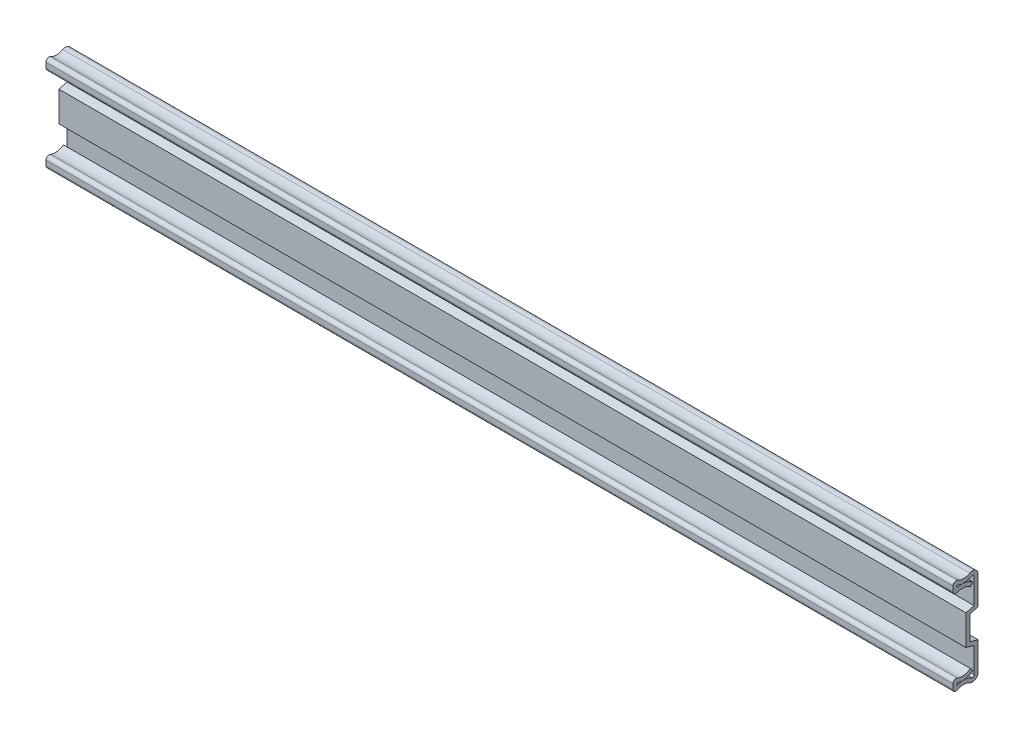
ISO-10303-21;
HEADER;
FILE_DESCRIPTION(('STEP AP214'),'2;1');
FILE_NAME('part.step','',(''),(''),'','','');
FILE_SCHEMA(('AUTOMOTIVE_DESIGN { 1 0 10303 214 1 1 1 1 }'));
ENDSEC;
DATA;
#1=APPLICATION_CONTEXT('core data for automotive mechanical design processes');
#2=APPLICATION_PROTOCOL_DEFINITION('international standard','automotive_design',2000,#1);
#3=PRODUCT_CONTEXT('',#1,'mechanical');
#4=PRODUCT('Part','Part','',(#3));
#5=PRODUCT_RELATED_PRODUCT_CATEGORY('part','',(#4));
#6=PRODUCT_DEFINITION_FORMATION('','',#4);
#7=PRODUCT_DEFINITION_CONTEXT('part definition',#1,'design');
#8=PRODUCT_DEFINITION('design','',#6,#7);
#9=PRODUCT_DEFINITION_SHAPE('','',#8);
#10=(LENGTH_UNIT() NAMED_UNIT(*) SI_UNIT(.MILLI.,.METRE.));
#11=(NAMED_UNIT(*) PLANE_ANGLE_UNIT() SI_UNIT($,.RADIAN.));
#12=(NAMED_UNIT(*) SI_UNIT($,.STERADIAN.) SOLID_ANGLE_UNIT());
#13=UNCERTAINTY_MEASURE_WITH_UNIT(LENGTH_MEASURE(1.E-05),#10,'distance_accuracy_value','');
#14=(GEOMETRIC_REPRESENTATION_CONTEXT(3) GLOBAL_UNCERTAINTY_ASSIGNED_CONTEXT((#13)) GLOBAL_UNIT_ASSIGNED_CONTEXT((#10,
#11,#12)) REPRESENTATION_CONTEXT('',''));
#15=CARTESIAN_POINT('',(0.,0.,0.));
#16=DIRECTION('',(0.,0.,1.));
#17=DIRECTION('',(1.,0.,0.));
#18=AXIS2_PLACEMENT_3D('',#15,#16,#17);
#19=CARTESIAN_POINT('',(-368.3,13.7952118464739,-2.60549626763331));
#20=DIRECTION('',(0.,-0.620994035630214,-0.783815289281665));
#21=DIRECTION('',(0.,0.783815289281665,-0.620994035630214));
#22=AXIS2_PLACEMENT_3D('',#19,#20,#21);
#23=PLANE('',#22);
#24=DIRECTION('',(0.,-0.783815289281665,0.620994035630214));
#25=VECTOR('',#24,1.);
#26=CARTESIAN_POINT('',(-14.224,14.3924790969065,-3.07869372278354));
#27=LINE('',#26,#25);
#28=CARTESIAN_POINT('',(-14.224,14.9897463473391,-3.55189117793377));
#29=VERTEX_POINT('',#28);
#30=CARTESIAN_POINT('',(-14.224,13.7952118464739,-2.60549626763331));
#31=VERTEX_POINT('',#30);
#32=EDGE_CURVE('E367',#29,#31,#27,.T.);
#33=ORIENTED_EDGE('',*,*,#32,.T.);
#34=DIRECTION('',(1.,0.,0.));
#35=VECTOR('',#34,1.);
#36=CARTESIAN_POINT('',(-191.262,13.7952118464739,-2.60549626763331));
#37=LINE('',#36,#35);
#38=CARTESIAN_POINT('',(-368.3,13.7952118464737,-2.60549626763321));
#39=VERTEX_POINT('',#38);
#40=EDGE_CURVE('E320',#39,#31,#37,.T.);
#41=ORIENTED_EDGE('',*,*,#40,.F.);
#42=DIRECTION('',(0.,0.783815289281665,-0.620994035630214));
#43=VECTOR('',#42,1.);
#44=CARTESIAN_POINT('',(-368.3,14.3924790969065,-3.07869372278354));
#45=LINE('',#44,#43);
#46=CARTESIAN_POINT('',(-368.3,14.9897463473391,-3.55189117793377));
#47=VERTEX_POINT('',#46);
#48=EDGE_CURVE('E369',#39,#47,#45,.T.);
#49=ORIENTED_EDGE('',*,*,#48,.T.);
#50=DIRECTION('',(-1.,0.,0.));
#51=VECTOR('',#50,1.);
#52=CARTESIAN_POINT('',(-191.262,14.9897463473391,-3.55189117793377));
#53=LINE('',#52,#51);
#54=EDGE_CURVE('E311',#29,#47,#53,.T.);
#55=ORIENTED_EDGE('',*,*,#54,.F.);
#56=EDGE_LOOP('',(#33,#41,#49,#55));
#57=FACE_BOUND('',#56,.T.);
#58=ADVANCED_FACE('F17',(#57),#23,.T.);
#59=CARTESIAN_POINT('',(-368.3,16.0437321100317,2.64570882206624));
#60=DIRECTION('',(0.,0.,-1.));
#61=DIRECTION('',(0.,1.,0.));
#62=AXIS2_PLACEMENT_3D('',#59,#60,#61);
#63=PLANE('',#62);
#64=DIRECTION('',(0.,-1.,0.));
#65=VECTOR('',#64,1.);
#66=CARTESIAN_POINT('',(-14.224,16.5009321100317,2.64570882206624));
#67=LINE('',#66,#65);
#68=CARTESIAN_POINT('',(-14.2239999999998,16.9581321100249,2.64570882206624));
#69=VERTEX_POINT('',#68);
#70=CARTESIAN_POINT('',(-14.224,16.0437321100317,2.64570882206624));
#71=VERTEX_POINT('',#70);
#72=EDGE_CURVE('E235',#69,#71,#67,.T.);
#73=ORIENTED_EDGE('',*,*,#72,.T.);
#74=DIRECTION('',(1.,0.,0.));
#75=VECTOR('',#74,1.);
#76=CARTESIAN_POINT('',(-191.262,16.0437321100317,2.64570882206624));
#77=LINE('',#76,#75);
#78=CARTESIAN_POINT('',(-368.3,16.0437321100317,2.64570882206624));
#79=VERTEX_POINT('',#78);
#80=EDGE_CURVE('E314',#79,#71,#77,.T.);
#81=ORIENTED_EDGE('',*,*,#80,.F.);
#82=DIRECTION('',(0.,1.,0.));
#83=VECTOR('',#82,1.);
#84=CARTESIAN_POINT('',(-368.3,16.5009321100317,2.64570882206624));
#85=LINE('',#84,#83);
#86=CARTESIAN_POINT('',(-368.3,16.9581321100317,2.64570882206624));
#87=VERTEX_POINT('',#86);
#88=EDGE_CURVE('E365',#79,#87,#85,.T.);
#89=ORIENTED_EDGE('',*,*,#88,.T.);
#90=DIRECTION('',(-1.,0.,0.));
#91=VECTOR('',#90,1.);
#92=CARTESIAN_POINT('',(-191.262,16.9581321100317,2.64570882206624));
#93=LINE('',#92,#91);
#94=EDGE_CURVE('E244',#69,#87,#93,.T.);
#95=ORIENTED_EDGE('',*,*,#94,.F.);
#96=EDGE_LOOP('',(#73,#81,#89,#95));
#97=FACE_BOUND('',#96,.T.);
#98=ADVANCED_FACE('F472',(#97),#63,.T.);
#99=CARTESIAN_POINT('',(-14.224,16.6561828524994,-3.4378409365448));
#100=DIRECTION('',(-1.,0.,0.));
#101=DIRECTION('',(0.,0.,1.));
#102=AXIS2_PLACEMENT_3D('',#99,#100,#101);
#103=CYLINDRICAL_SURFACE('',#102,0.622050241389);
#104=CARTESIAN_POINT('',(-14.224,16.6561828524994,-3.4378409365448));
#105=DIRECTION('',(-1.,0.,0.));
#106=DIRECTION('',(0.,0.,1.));
#107=AXIS2_PLACEMENT_3D('',#104,#105,#106);
#108=CIRCLE('',#107,0.622050241389);
#109=CARTESIAN_POINT('',(-14.224,16.6561828524994,-4.05989117793377));
#110=VERTEX_POINT('',#109);
#111=CARTESIAN_POINT('',(-14.2239999999999,17.2018334118244,-3.13915720762672));
#112=VERTEX_POINT('',#111);
#113=EDGE_CURVE('E234',#110,#112,#108,.F.);
#114=ORIENTED_EDGE('',*,*,#113,.T.);
#115=DIRECTION('',(1.,0.,0.));
#116=VECTOR('',#115,1.);
#117=CARTESIAN_POINT('',(-191.262,17.2018334118245,-3.13915720762698));
#118=LINE('',#117,#116);
#119=CARTESIAN_POINT('',(-368.3,17.2018334118245,-3.13915720762696));
#120=VERTEX_POINT('',#119);
#121=EDGE_CURVE('E232',#120,#112,#118,.T.);
#122=ORIENTED_EDGE('',*,*,#121,.F.);
#123=CARTESIAN_POINT('',(-368.3,16.6561828524994,-3.4378409365448));
#124=DIRECTION('',(-1.,0.,0.));
#125=DIRECTION('',(0.,0.,1.));
#126=AXIS2_PLACEMENT_3D('',#123,#124,#125);
#127=CIRCLE('',#126,0.622050241389);
#128=CARTESIAN_POINT('',(-368.3,16.6561828524994,-4.05989117793377));
#129=VERTEX_POINT('',#128);
#130=EDGE_CURVE('E21',#120,#129,#127,.T.);
#131=ORIENTED_EDGE('',*,*,#130,.T.);
#132=DIRECTION('',(-1.,0.,0.));
#133=VECTOR('',#132,1.);
#134=CARTESIAN_POINT('',(-191.262,16.6561828524995,-4.05989117793377));
#135=LINE('',#134,#133);
#136=EDGE_CURVE('E229',#110,#129,#135,.T.);
#137=ORIENTED_EDGE('',*,*,#136,.F.);
#138=EDGE_LOOP('',(#114,#122,#131,#137));
#139=FACE_BOUND('',#138,.T.);
#140=ADVANCED_FACE('F228',(#139),#103,.F.);
#141=CARTESIAN_POINT('',(-14.224,-16.6561828524995,-3.43784093654483));
#142=DIRECTION('',(-1.,0.,0.));
#143=DIRECTION('',(0.,0.,1.));
#144=AXIS2_PLACEMENT_3D('',#141,#142,#143);
#145=CYLINDRICAL_SURFACE('',#144,0.622050241388938);
#146=CARTESIAN_POINT('',(-14.224,-16.6561828524995,-3.43784093654483));
#147=DIRECTION('',(-1.,0.,0.));
#148=DIRECTION('',(0.,0.,1.));
#149=AXIS2_PLACEMENT_3D('',#146,#147,#148);
#150=CIRCLE('',#149,0.622050241388938);
#151=CARTESIAN_POINT('',(-14.2239999999999,-17.2018334118244,-3.13915720762674));
#152=VERTEX_POINT('',#151);
#153=CARTESIAN_POINT('',(-14.2239999999999,-16.6561828524995,-4.05989117793375));
#154=VERTEX_POINT('',#153);
#155=EDGE_CURVE('E363',#152,#154,#150,.F.);
#156=ORIENTED_EDGE('',*,*,#155,.T.);
#157=DIRECTION('',(1.,0.,0.));
#158=VECTOR('',#157,1.);
#159=CARTESIAN_POINT('',(-191.262,-16.6561828524995,-4.05989117793374));
#160=LINE('',#159,#158);
#161=CARTESIAN_POINT('',(-368.3,-16.6561828525003,-4.05989117793374));
#162=VERTEX_POINT('',#161);
#163=EDGE_CURVE('E296',#162,#154,#160,.T.);
#164=ORIENTED_EDGE('',*,*,#163,.F.);
#165=CARTESIAN_POINT('',(-368.3,-16.6561828525012,-3.43784093654787));
#166=DIRECTION('',(-1.,0.,0.));
#167=DIRECTION('',(0.,0.,1.));
#168=AXIS2_PLACEMENT_3D('',#165,#166,#167);
#169=CIRCLE('',#168,0.622050241388938);
#170=CARTESIAN_POINT('',(-368.3,-17.2018334118253,-3.13915720762836));
#171=VERTEX_POINT('',#170);
#172=EDGE_CURVE('E463',#162,#171,#169,.T.);
#173=ORIENTED_EDGE('',*,*,#172,.T.);
#174=DIRECTION('',(-1.,0.,0.));
#175=VECTOR('',#174,1.);
#176=CARTESIAN_POINT('',(-191.262,-17.2018334118245,-3.13915720762695));
#177=LINE('',#176,#175);
#178=EDGE_CURVE('E287',#152,#171,#177,.T.);
#179=ORIENTED_EDGE('',*,*,#178,.F.);
#180=EDGE_LOOP('',(#156,#164,#173,#179));
#181=FACE_BOUND('',#180,.T.);
#182=ADVANCED_FACE('F814',(#181),#145,.F.);
#183=CARTESIAN_POINT('',(-14.224,-16.9581321100317,2.64570882206624));
#184=DIRECTION('',(0.,0.,-1.));
#185=DIRECTION('',(-1.,0.,0.));
#186=AXIS2_PLACEMENT_3D('',#183,#184,#185);
#187=PLANE('',#186);
#188=DIRECTION('',(0.,-1.,0.));
#189=VECTOR('',#188,1.);
#190=CARTESIAN_POINT('',(-14.224,-16.5009321100317,2.64570882206624));
#191=LINE('',#190,#189);
#192=CARTESIAN_POINT('',(-14.224,-16.0437321100317,2.64570882206624));
#193=VERTEX_POINT('',#192);
#194=CARTESIAN_POINT('',(-14.2239999999998,-16.9581321100249,2.64570882206624));
#195=VERTEX_POINT('',#194);
#196=EDGE_CURVE('E359',#193,#195,#191,.T.);
#197=ORIENTED_EDGE('',*,*,#196,.T.);
#198=DIRECTION('',(1.,0.,0.));
#199=VECTOR('',#198,1.);
#200=CARTESIAN_POINT('',(-191.262,-16.9581321100317,2.64570882206624));
#201=LINE('',#200,#199);
#202=CARTESIAN_POINT('',(-368.3,-16.9581321100317,2.64570882206624));
#203=VERTEX_POINT('',#202);
#204=EDGE_CURVE('E290',#203,#195,#201,.T.);
#205=ORIENTED_EDGE('',*,*,#204,.F.);
#206=DIRECTION('',(0.,1.,0.));
#207=VECTOR('',#206,1.);
#208=CARTESIAN_POINT('',(-368.3,-16.5009321100317,2.64570882206624));
#209=LINE('',#208,#207);
#210=CARTESIAN_POINT('',(-368.3,-16.0437321100317,2.64570882206624));
#211=VERTEX_POINT('',#210);
#212=EDGE_CURVE('E361',#203,#211,#209,.T.);
#213=ORIENTED_EDGE('',*,*,#212,.T.);
#214=DIRECTION('',(-1.,0.,0.));
#215=VECTOR('',#214,1.);
#216=CARTESIAN_POINT('',(-191.262,-16.0437321100317,2.64570882206624));
#217=LINE('',#216,#215);
#218=EDGE_CURVE('E283',#193,#211,#217,.T.);
#219=ORIENTED_EDGE('',*,*,#218,.F.);
#220=EDGE_LOOP('',(#197,#205,#213,#219));
#221=FACE_BOUND('',#220,.T.);
#222=ADVANCED_FACE('F805',(#221),#187,.T.);
#223=CARTESIAN_POINT('',(-368.3,-14.9897463473391,-3.55189117793377));
#224=DIRECTION('',(0.,0.620994035630214,-0.783815289281665));
#225=DIRECTION('',(0.,0.783815289281665,0.620994035630214));
#226=AXIS2_PLACEMENT_3D('',#223,#224,#225);
#227=PLANE('',#226);
#228=DIRECTION('',(0.,-0.783815289281665,-0.620994035630214));
#229=VECTOR('',#228,1.);
#230=CARTESIAN_POINT('',(-14.224,-14.3924790969065,-3.07869372278354));
#231=LINE('',#230,#229);
#232=CARTESIAN_POINT('',(-14.224,-13.7952118464739,-2.60549626763331));
#233=VERTEX_POINT('',#232);
#234=CARTESIAN_POINT('',(-14.224,-14.9897463473391,-3.55189117793377));
#235=VERTEX_POINT('',#234);
#236=EDGE_CURVE('E345',#233,#235,#231,.T.);
#237=ORIENTED_EDGE('',*,*,#236,.T.);
#238=DIRECTION('',(1.,0.,0.));
#239=VECTOR('',#238,1.);
#240=CARTESIAN_POINT('',(-191.262,-14.9897463473391,-3.55189117793377));
#241=LINE('',#240,#239);
#242=CARTESIAN_POINT('',(-368.3,-14.9897463473391,-3.55189117793377));
#243=VERTEX_POINT('',#242);
#244=EDGE_CURVE('E284',#243,#235,#241,.T.);
#245=ORIENTED_EDGE('',*,*,#244,.F.);
#246=DIRECTION('',(0.,0.783815289281665,0.620994035630214));
#247=VECTOR('',#246,1.);
#248=CARTESIAN_POINT('',(-368.3,-14.3924790969065,-3.07869372278354));
#249=LINE('',#248,#247);
#250=CARTESIAN_POINT('',(-368.3,-13.7952118464737,-2.60549626763321));
#251=VERTEX_POINT('',#250);
#252=EDGE_CURVE('E357',#243,#251,#249,.T.);
#253=ORIENTED_EDGE('',*,*,#252,.T.);
#254=DIRECTION('',(-1.,0.,0.));
#255=VECTOR('',#254,1.);
#256=CARTESIAN_POINT('',(-191.262,-13.7952118464739,-2.60549626763331));
#257=LINE('',#256,#255);
#258=EDGE_CURVE('E280',#233,#251,#257,.T.);
#259=ORIENTED_EDGE('',*,*,#258,.F.);
#260=EDGE_LOOP('',(#237,#245,#253,#259));
#261=FACE_BOUND('',#260,.T.);
#262=ADVANCED_FACE('F797',(#261),#227,.T.);
#263=CARTESIAN_POINT('',(-368.3,-5.55625,-5.58389117793377));
#264=DIRECTION('',(0.,0.965925826289069,-0.258819045102518));
#265=DIRECTION('',(0.,0.258819045102518,0.965925826289069));
#266=AXIS2_PLACEMENT_3D('',#263,#264,#265);
#267=PLANE('',#266);
#268=DIRECTION('',(0.,0.258819045102518,0.965925826289069));
#269=VECTOR('',#268,1.);
#270=CARTESIAN_POINT('',(-14.224,-5.55625,-5.58389117793376));
#271=LINE('',#270,#269);
#272=CARTESIAN_POINT('',(-14.2239999999999,-5.55625,-5.58389117793377));
#273=VERTEX_POINT('',#272);
#274=CARTESIAN_POINT('',(-14.2239999999999,-4.7055113140312,-2.40889117793376));
#275=VERTEX_POINT('',#274);
#276=EDGE_CURVE('E343',#273,#275,#271,.T.);
#277=ORIENTED_EDGE('',*,*,#276,.F.);
#278=DIRECTION('',(1.,0.,0.));
#279=VECTOR('',#278,1.);
#280=CARTESIAN_POINT('',(-191.262,-5.55625,-5.58389117793377));
#281=LINE('',#280,#279);
#282=CARTESIAN_POINT('',(-368.3,-5.55625,-5.58389117793377));
#283=VERTEX_POINT('',#282);
#284=EDGE_CURVE('E346',#283,#273,#281,.T.);
#285=ORIENTED_EDGE('',*,*,#284,.F.);
#286=DIRECTION('',(0.,-0.258819045102518,-0.965925826289069));
#287=VECTOR('',#286,1.);
#288=CARTESIAN_POINT('',(-368.3,-4.7055113140312,-2.40889117793376));
#289=LINE('',#288,#287);
#290=CARTESIAN_POINT('',(-368.3,-4.7055113140312,-2.40889117793376));
#291=VERTEX_POINT('',#290);
#292=EDGE_CURVE('E353',#291,#283,#289,.T.);
#293=ORIENTED_EDGE('',*,*,#292,.F.);
#294=DIRECTION('',(-1.,0.,0.));
#295=VECTOR('',#294,1.);
#296=CARTESIAN_POINT('',(-191.262,-4.7055113140312,-2.40889117793375));
#297=LINE('',#296,#295);
#298=EDGE_CURVE('E338',#275,#291,#297,.T.);
#299=ORIENTED_EDGE('',*,*,#298,.F.);
#300=EDGE_LOOP('',(#277,#285,#293,#299));
#301=FACE_BOUND('',#300,.T.);
#302=ADVANCED_FACE('F545',(#301),#267,.T.);
#303=CARTESIAN_POINT('',(-368.3,-4.7055113140312,-2.40889117793375));
#304=DIRECTION('',(0.,0.,-1.));
#305=DIRECTION('',(0.,1.,0.));
#306=AXIS2_PLACEMENT_3D('',#303,#304,#305);
#307=PLANE('',#306);
#308=DIRECTION('',(0.,1.,0.));
#309=VECTOR('',#308,1.);
#310=CARTESIAN_POINT('',(-14.224,0.,-2.40889117793376));
#311=LINE('',#310,#309);
#312=CARTESIAN_POINT('',(-14.2239999999999,4.70551131403119,-2.40889117793376));
#313=VERTEX_POINT('',#312);
#314=EDGE_CURVE('E339',#275,#313,#311,.T.);
#315=ORIENTED_EDGE('',*,*,#314,.F.);
#316=ORIENTED_EDGE('',*,*,#298,.T.);
#317=DIRECTION('',(0.,-1.,0.));
#318=VECTOR('',#317,1.);
#319=CARTESIAN_POINT('',(-368.3,0.,-2.40889117793376));
#320=LINE('',#319,#318);
#321=CARTESIAN_POINT('',(-368.3,4.70551131403119,-2.40889117793376));
#322=VERTEX_POINT('',#321);
#323=EDGE_CURVE('E350',#322,#291,#320,.T.);
#324=ORIENTED_EDGE('',*,*,#323,.F.);
#325=DIRECTION('',(-1.,0.,0.));
#326=VECTOR('',#325,1.);
#327=CARTESIAN_POINT('',(-191.262,4.7055113140312,-2.40889117793375));
#328=LINE('',#327,#326);
#329=EDGE_CURVE('E336',#313,#322,#328,.T.);
#330=ORIENTED_EDGE('',*,*,#329,.F.);
#331=EDGE_LOOP('',(#315,#316,#324,#330));
#332=FACE_BOUND('',#331,.T.);
#333=ADVANCED_FACE('F549',(#332),#307,.T.);
#334=CARTESIAN_POINT('',(-368.3,4.7055113140312,-2.40889117793375));
#335=DIRECTION('',(0.,-0.965925826289069,-0.258819045102518));
#336=DIRECTION('',(0.,0.258819045102518,-0.965925826289069));
#337=AXIS2_PLACEMENT_3D('',#334,#335,#336);
#338=PLANE('',#337);
#339=DIRECTION('',(0.,0.258819045102518,-0.965925826289069));
#340=VECTOR('',#339,1.);
#341=CARTESIAN_POINT('',(-14.224,4.70551131403119,-2.40889117793375));
#342=LINE('',#341,#340);
#343=CARTESIAN_POINT('',(-14.2239999999999,5.55625,-5.58389117793377));
#344=VERTEX_POINT('',#343);
#345=EDGE_CURVE('E342',#313,#344,#342,.T.);
#346=ORIENTED_EDGE('',*,*,#345,.F.);
#347=ORIENTED_EDGE('',*,*,#329,.T.);
#348=DIRECTION('',(0.,-0.258819045102519,0.965925826289069));
#349=VECTOR('',#348,1.);
#350=CARTESIAN_POINT('',(-368.3,5.55625,-5.58389117793377));
#351=LINE('',#350,#349);
#352=CARTESIAN_POINT('',(-368.3,5.55625,-5.58389117793377));
#353=VERTEX_POINT('',#352);
#354=EDGE_CURVE('E354',#353,#322,#351,.T.);
#355=ORIENTED_EDGE('',*,*,#354,.F.);
#356=DIRECTION('',(-1.,0.,0.));
#357=VECTOR('',#356,1.);
#358=CARTESIAN_POINT('',(-191.262,5.55625,-5.58389117793377));
#359=LINE('',#358,#357);
#360=EDGE_CURVE('E334',#344,#353,#359,.T.);
#361=ORIENTED_EDGE('',*,*,#360,.F.);
#362=EDGE_LOOP('',(#346,#347,#355,#361));
#363=FACE_BOUND('',#362,.T.);
#364=ADVANCED_FACE('F553',(#363),#338,.T.);
#365=CARTESIAN_POINT('',(-368.3,5.55625,-5.58389117793377));
#366=DIRECTION('',(0.,0.,-1.));
#367=DIRECTION('',(0.,1.,0.));
#368=AXIS2_PLACEMENT_3D('',#365,#366,#367);
#369=PLANE('',#368);
#370=DIRECTION('',(0.,1.,0.));
#371=VECTOR('',#370,1.);
#372=CARTESIAN_POINT('',(-14.224,0.,-5.58389117793377));
#373=LINE('',#372,#371);
#374=CARTESIAN_POINT('',(-14.224,16.6561828524995,-5.58389117793377));
#375=VERTEX_POINT('',#374);
#376=EDGE_CURVE('E422',#344,#375,#373,.T.);
#377=ORIENTED_EDGE('',*,*,#376,.F.);
#378=ORIENTED_EDGE('',*,*,#360,.T.);
#379=DIRECTION('',(0.,-1.,0.));
#380=VECTOR('',#379,1.);
#381=CARTESIAN_POINT('',(-368.3,0.,-5.58389117793377));
#382=LINE('',#381,#380);
#383=CARTESIAN_POINT('',(-368.3,16.6561828524995,-5.58389117793377));
#384=VERTEX_POINT('',#383);
#385=EDGE_CURVE('E430',#384,#353,#382,.T.);
#386=ORIENTED_EDGE('',*,*,#385,.F.);
#387=DIRECTION('',(-1.,0.,0.));
#388=VECTOR('',#387,1.);
#389=CARTESIAN_POINT('',(-191.262,16.6561828524995,-5.58389117793377));
#390=LINE('',#389,#388);
#391=EDGE_CURVE('E332',#375,#384,#390,.T.);
#392=ORIENTED_EDGE('',*,*,#391,.F.);
#393=EDGE_LOOP('',(#377,#378,#386,#392));
#394=FACE_BOUND('',#393,.T.);
#395=ADVANCED_FACE('F554',(#394),#369,.T.);
#396=CARTESIAN_POINT('',(-368.3,16.6561828524995,-3.43784093654482));
#397=DIRECTION('',(1.,0.,0.));
#398=DIRECTION('',(0.,0.,-1.));
#399=AXIS2_PLACEMENT_3D('',#396,#397,#398);
#400=CYLINDRICAL_SURFACE('',#399,2.14605024138894);
#401=CARTESIAN_POINT('',(-14.224,16.6561828524995,-3.43784093654482));
#402=DIRECTION('',(1.,0.,0.));
#403=DIRECTION('',(0.,0.,-1.));
#404=AXIS2_PLACEMENT_3D('',#401,#402,#403);
#405=CIRCLE('',#404,2.14605024138894);
#406=CARTESIAN_POINT('',(-14.224,18.5386570268346,-2.40739315934943));
#407=VERTEX_POINT('',#406);
#408=EDGE_CURVE('E419',#375,#407,#405,.T.);
#409=ORIENTED_EDGE('',*,*,#408,.F.);
#410=ORIENTED_EDGE('',*,*,#391,.T.);
#411=CARTESIAN_POINT('',(-368.3,16.6561828524995,-3.43784093654482));
#412=DIRECTION('',(1.,0.,0.));
#413=DIRECTION('',(0.,0.,-1.));
#414=AXIS2_PLACEMENT_3D('',#411,#412,#413);
#415=CIRCLE('',#414,2.14605024138894);
#416=CARTESIAN_POINT('',(-368.3,18.5386570268346,-2.40739315934946));
#417=VERTEX_POINT('',#416);
#418=EDGE_CURVE('E431',#417,#384,#415,.F.);
#419=ORIENTED_EDGE('',*,*,#418,.F.);
#420=DIRECTION('',(-1.,0.,0.));
#421=VECTOR('',#420,1.);
#422=CARTESIAN_POINT('',(-191.262,18.5386570268346,-2.40739315934942));
#423=LINE('',#422,#421);
#424=EDGE_CURVE('E330',#407,#417,#423,.T.);
#425=ORIENTED_EDGE('',*,*,#424,.F.);
#426=EDGE_LOOP('',(#409,#410,#419,#425));
#427=FACE_BOUND('',#426,.T.);
#428=ADVANCED_FACE('F504',(#427),#400,.T.);
#429=CARTESIAN_POINT('',(-14.2239999999999,22.9366047445547,0.));
#430=DIRECTION('',(-1.,0.,0.));
#431=DIRECTION('',(0.,-1.,0.));
#432=AXIS2_PLACEMENT_3D('',#429,#430,#431);
#433=CYLINDRICAL_SURFACE('',#432,5.01372974455966);
#434=CARTESIAN_POINT('',(-14.2239999999999,22.9366047445547,0.));
#435=DIRECTION('',(-1.,0.,0.));
#436=DIRECTION('',(0.,-1.,0.));
#437=AXIS2_PLACEMENT_3D('',#434,#435,#436);
#438=CIRCLE('',#437,5.01372974455966);
#439=CARTESIAN_POINT('',(-14.224,18.5386570268228,2.4073931593289));
#440=VERTEX_POINT('',#439);
#441=EDGE_CURVE('E416',#407,#440,#438,.T.);
#442=ORIENTED_EDGE('',*,*,#441,.F.);
#443=ORIENTED_EDGE('',*,*,#424,.T.);
#444=CARTESIAN_POINT('',(-368.3,22.9366047445552,0.));
#445=DIRECTION('',(-1.,0.,0.));
#446=DIRECTION('',(0.,-1.,0.));
#447=AXIS2_PLACEMENT_3D('',#444,#445,#446);
#448=CIRCLE('',#447,5.01372974455966);
#449=CARTESIAN_POINT('',(-368.3,18.5386570268347,2.40739315934933));
#450=VERTEX_POINT('',#449);
#451=EDGE_CURVE('E434',#450,#417,#448,.F.);
#452=ORIENTED_EDGE('',*,*,#451,.F.);
#453=DIRECTION('',(-1.,0.,0.));
#454=VECTOR('',#453,1.);
#455=CARTESIAN_POINT('',(-191.262,18.5386570268346,2.40739315934941));
#456=LINE('',#455,#454);
#457=EDGE_CURVE('E328',#440,#450,#456,.T.);
#458=ORIENTED_EDGE('',*,*,#457,.F.);
#459=EDGE_LOOP('',(#442,#443,#452,#458));
#460=FACE_BOUND('',#459,.T.);
#461=ADVANCED_FACE('F500',(#460),#433,.F.);
#462=CARTESIAN_POINT('',(-368.3,17.494263577608,2.97908382206622));
#463=DIRECTION('',(1.,0.,-1.43608071807944E-13));
#464=DIRECTION('',(-1.43608071807944E-13,0.,-1.));
#465=AXIS2_PLACEMENT_3D('',#462,#463,#464);
#466=CYLINDRICAL_SURFACE('',#465,1.19062500000001);
#467=CARTESIAN_POINT('',(-14.2240000000001,17.494263577579,2.97908382201537));
#468=DIRECTION('',(1.,0.,-1.43608071807944E-13));
#469=DIRECTION('',(-1.43608071807944E-13,0.,-1.));
#470=AXIS2_PLACEMENT_3D('',#467,#468,#469);
#471=CIRCLE('',#470,1.19062500000001);
#472=CARTESIAN_POINT('',(-14.224,17.4942635775935,4.16970882206624));
#473=VERTEX_POINT('',#472);
#474=EDGE_CURVE('E413',#440,#473,#471,.T.);
#475=ORIENTED_EDGE('',*,*,#474,.F.);
#476=ORIENTED_EDGE('',*,*,#457,.T.);
#477=CARTESIAN_POINT('',(-368.3,17.494263577608,2.97908382206622));
#478=DIRECTION('',(1.,0.,-1.43608071807944E-13));
#479=DIRECTION('',(-1.43608071807944E-13,0.,-1.));
#480=AXIS2_PLACEMENT_3D('',#477,#478,#479);
#481=CIRCLE('',#480,1.19062500000001);
#482=CARTESIAN_POINT('',(-368.3,17.494263577608,4.16970882206624));
#483=VERTEX_POINT('',#482);
#484=EDGE_CURVE('E437',#483,#450,#481,.F.);
#485=ORIENTED_EDGE('',*,*,#484,.F.);
#486=DIRECTION('',(-1.,0.,0.));
#487=VECTOR('',#486,1.);
#488=CARTESIAN_POINT('',(-191.262,17.494263577608,4.16970882206624));
#489=LINE('',#488,#487);
#490=EDGE_CURVE('E326',#473,#483,#489,.T.);
#491=ORIENTED_EDGE('',*,*,#490,.F.);
#492=EDGE_LOOP('',(#475,#476,#485,#491));
#493=FACE_BOUND('',#492,.T.);
#494=ADVANCED_FACE('F497',(#493),#466,.T.);
#495=CARTESIAN_POINT('',(-368.3,17.494263577608,4.16970882206624));
#496=DIRECTION('',(0.,0.,1.));
#497=DIRECTION('',(0.,-1.,0.));
#498=AXIS2_PLACEMENT_3D('',#495,#496,#497);
#499=PLANE('',#498);
#500=DIRECTION('',(0.,-1.,0.));
#501=VECTOR('',#500,1.);
#502=CARTESIAN_POINT('',(-14.224,0.,4.16970882206624));
#503=LINE('',#502,#501);
#504=CARTESIAN_POINT('',(-14.2239999999999,15.5563985518815,4.16970882206624));
#505=VERTEX_POINT('',#504);
#506=EDGE_CURVE('E412',#473,#505,#503,.T.);
#507=ORIENTED_EDGE('',*,*,#506,.F.);
#508=ORIENTED_EDGE('',*,*,#490,.T.);
#509=DIRECTION('',(0.,1.,0.));
#510=VECTOR('',#509,1.);
#511=CARTESIAN_POINT('',(-368.3,0.,4.16970882206624));
#512=LINE('',#511,#510);
#513=CARTESIAN_POINT('',(-368.3,15.5563985519135,4.16970882206624));
#514=VERTEX_POINT('',#513);
#515=EDGE_CURVE('E258',#514,#483,#512,.T.);
#516=ORIENTED_EDGE('',*,*,#515,.F.);
#517=DIRECTION('',(-1.,0.,0.));
#518=VECTOR('',#517,1.);
#519=CARTESIAN_POINT('',(-191.262,15.5563985519135,4.16970882206624));
#520=LINE('',#519,#518);
#521=EDGE_CURVE('E323',#505,#514,#520,.T.);
#522=ORIENTED_EDGE('',*,*,#521,.F.);
#523=EDGE_LOOP('',(#507,#508,#516,#522));
#524=FACE_BOUND('',#523,.T.);
#525=ADVANCED_FACE('F492',(#524),#499,.T.);
#526=CARTESIAN_POINT('',(-368.3,15.5563985519135,2.97908382206625));
#527=DIRECTION('',(1.,-1.81065908939785E-13,0.));
#528=DIRECTION('',(1.81065908939785E-13,1.,0.));
#529=AXIS2_PLACEMENT_3D('',#526,#527,#528);
#530=CYLINDRICAL_SURFACE('',#529,1.19062500000003);
#531=CARTESIAN_POINT('',(-14.2239999999997,15.5563985518494,2.97908382207174));
#532=DIRECTION('',(1.,-1.81065908939785E-13,0.));
#533=DIRECTION('',(1.81065908939785E-13,1.,0.));
#534=AXIS2_PLACEMENT_3D('',#531,#532,#533);
#535=CIRCLE('',#534,1.19062500000003);
#536=CARTESIAN_POINT('',(-14.2239999999999,14.4642823521204,2.50487912283347));
#537=VERTEX_POINT('',#536);
#538=EDGE_CURVE('E409',#505,#537,#535,.T.);
#539=ORIENTED_EDGE('',*,*,#538,.F.);
#540=ORIENTED_EDGE('',*,*,#521,.T.);
#541=CARTESIAN_POINT('',(-368.3,15.5563985519135,2.97908382206625));
#542=DIRECTION('',(1.,-1.81065908939785E-13,0.));
#543=DIRECTION('',(1.81065908939785E-13,1.,0.));
#544=AXIS2_PLACEMENT_3D('',#541,#542,#543);
#545=CIRCLE('',#544,1.19062500000003);
#546=CARTESIAN_POINT('',(-368.3,14.4642823521253,2.50487912282215));
#547=VERTEX_POINT('',#546);
#548=EDGE_CURVE('E440',#547,#514,#545,.F.);
#549=ORIENTED_EDGE('',*,*,#548,.F.);
#550=DIRECTION('',(-1.,0.,0.));
#551=VECTOR('',#550,1.);
#552=CARTESIAN_POINT('',(-191.262,14.4642823521253,2.50487912282214));
#553=LINE('',#552,#551);
#554=EDGE_CURVE('E317',#537,#547,#553,.T.);
#555=ORIENTED_EDGE('',*,*,#554,.F.);
#556=EDGE_LOOP('',(#539,#540,#549,#555));
#557=FACE_BOUND('',#556,.T.);
#558=ADVANCED_FACE('F487',(#557),#530,.T.);
#559=CARTESIAN_POINT('',(-14.2239999999999,9.86537381636176,0.507999999999994));
#560=DIRECTION('',(-1.,0.,0.));
#561=DIRECTION('',(0.,-1.,0.));
#562=AXIS2_PLACEMENT_3D('',#559,#560,#561);
#563=CYLINDRICAL_SURFACE('',#562,5.01372974455962);
#564=CARTESIAN_POINT('',(-14.2239999999999,9.86537381636176,0.507999999999994));
#565=DIRECTION('',(-1.,0.,0.));
#566=DIRECTION('',(0.,-1.,0.));
#567=AXIS2_PLACEMENT_3D('',#564,#565,#566);
#568=CIRCLE('',#567,5.01372974455962);
#569=EDGE_CURVE('E406',#537,#31,#568,.T.);
#570=ORIENTED_EDGE('',*,*,#569,.F.);
#571=ORIENTED_EDGE('',*,*,#554,.T.);
#572=CARTESIAN_POINT('',(-368.3,9.86537381636136,0.508000000000046));
#573=DIRECTION('',(-1.,0.,0.));
#574=DIRECTION('',(0.,-1.,0.));
#575=AXIS2_PLACEMENT_3D('',#572,#573,#574);
#576=CIRCLE('',#575,5.01372974455962);
#577=EDGE_CURVE('E443',#39,#547,#576,.F.);
#578=ORIENTED_EDGE('',*,*,#577,.F.);
#579=ORIENTED_EDGE('',*,*,#40,.T.);
#580=EDGE_LOOP('',(#570,#571,#578,#579));
#581=FACE_BOUND('',#580,.T.);
#582=ADVANCED_FACE('F484',(#581),#563,.F.);
#583=CARTESIAN_POINT('',(-368.3,9.86537381636177,0.507999999999968));
#584=DIRECTION('',(1.,0.,0.));
#585=DIRECTION('',(0.,0.,-1.));
#586=AXIS2_PLACEMENT_3D('',#583,#584,#585);
#587=CYLINDRICAL_SURFACE('',#586,6.5377297445596);
#588=CARTESIAN_POINT('',(-14.224,9.86537381636177,0.507999999999968));
#589=DIRECTION('',(1.,0.,0.));
#590=DIRECTION('',(0.,0.,-1.));
#591=AXIS2_PLACEMENT_3D('',#588,#589,#590);
#592=CIRCLE('',#591,6.5377297445596);
#593=EDGE_CURVE('E403',#29,#71,#592,.T.);
#594=ORIENTED_EDGE('',*,*,#593,.F.);
#595=ORIENTED_EDGE('',*,*,#54,.T.);
#596=CARTESIAN_POINT('',(-368.3,9.86537381636177,0.507999999999968));
#597=DIRECTION('',(1.,0.,0.));
#598=DIRECTION('',(0.,0.,-1.));
#599=AXIS2_PLACEMENT_3D('',#596,#597,#598);
#600=CIRCLE('',#599,6.5377297445596);
#601=EDGE_CURVE('E252',#79,#47,#600,.F.);
#602=ORIENTED_EDGE('',*,*,#601,.F.);
#603=ORIENTED_EDGE('',*,*,#80,.T.);
#604=EDGE_LOOP('',(#594,#595,#602,#603));
#605=FACE_BOUND('',#604,.T.);
#606=ADVANCED_FACE('F475',(#605),#587,.T.);
#607=CARTESIAN_POINT('',(-368.3,22.9366047445548,0.));
#608=DIRECTION('',(1.,0.,0.));
#609=DIRECTION('',(0.,1.,0.));
#610=AXIS2_PLACEMENT_3D('',#607,#608,#609);
#611=CYLINDRICAL_SURFACE('',#610,6.53772974455973);
#612=CARTESIAN_POINT('',(-14.2239999999997,22.936604744541,-6.04204951141242E-13));
#613=DIRECTION('',(1.,0.,0.));
#614=DIRECTION('',(0.,1.,0.));
#615=AXIS2_PLACEMENT_3D('',#612,#613,#614);
#616=CIRCLE('',#615,6.53772974455973);
#617=EDGE_CURVE('E400',#69,#112,#616,.T.);
#618=ORIENTED_EDGE('',*,*,#617,.F.);
#619=ORIENTED_EDGE('',*,*,#94,.T.);
#620=CARTESIAN_POINT('',(-368.3,22.9366047445548,0.));
#621=DIRECTION('',(1.,0.,0.));
#622=DIRECTION('',(0.,1.,0.));
#623=AXIS2_PLACEMENT_3D('',#620,#621,#622);
#624=CIRCLE('',#623,6.53772974455973);
#625=EDGE_CURVE('E250',#120,#87,#624,.F.);
#626=ORIENTED_EDGE('',*,*,#625,.F.);
#627=ORIENTED_EDGE('',*,*,#121,.T.);
#628=EDGE_LOOP('',(#618,#619,#626,#627));
#629=FACE_BOUND('',#628,.T.);
#630=ADVANCED_FACE('F466',(#629),#611,.T.);
#631=CARTESIAN_POINT('',(-368.3,16.6561828524995,-4.05989117793377));
#632=DIRECTION('',(0.,0.,1.));
#633=DIRECTION('',(0.,-1.,0.));
#634=AXIS2_PLACEMENT_3D('',#631,#632,#633);
#635=PLANE('',#634);
#636=DIRECTION('',(0.,-1.,0.));
#637=VECTOR('',#636,1.);
#638=CARTESIAN_POINT('',(-14.224,0.,-4.05989117793377));
#639=LINE('',#638,#637);
#640=CARTESIAN_POINT('',(-14.2239999999999,6.72565632967995,-4.05989117793377));
#641=VERTEX_POINT('',#640);
#642=EDGE_CURVE('E242',#110,#641,#639,.T.);
#643=ORIENTED_EDGE('',*,*,#642,.F.);
#644=ORIENTED_EDGE('',*,*,#136,.T.);
#645=DIRECTION('',(0.,1.,0.));
#646=VECTOR('',#645,1.);
#647=CARTESIAN_POINT('',(-368.3,0.,-4.05989117793377));
#648=LINE('',#647,#646);
#649=CARTESIAN_POINT('',(-368.3,6.72565632967995,-4.05989117793377));
#650=VERTEX_POINT('',#649);
#651=EDGE_CURVE('E239',#650,#129,#648,.T.);
#652=ORIENTED_EDGE('',*,*,#651,.F.);
#653=DIRECTION('',(-1.,0.,0.));
#654=VECTOR('',#653,1.);
#655=CARTESIAN_POINT('',(-191.262,6.72565632967995,-4.05989117793377));
#656=LINE('',#655,#654);
#657=EDGE_CURVE('E243',#641,#650,#656,.T.);
#658=ORIENTED_EDGE('',*,*,#657,.F.);
#659=EDGE_LOOP('',(#643,#644,#652,#658));
#660=FACE_BOUND('',#659,.T.);
#661=ADVANCED_FACE('F238',(#660),#635,.T.);
#662=CARTESIAN_POINT('',(-368.3,6.72565632967995,-4.05989117793377));
#663=DIRECTION('',(0.,0.965925826289069,0.258819045102518));
#664=DIRECTION('',(0.,-0.258819045102518,0.965925826289069));
#665=AXIS2_PLACEMENT_3D('',#662,#663,#664);
#666=PLANE('',#665);
#667=DIRECTION('',(0.,-0.258819045102517,0.965925826289069));
#668=VECTOR('',#667,1.);
#669=CARTESIAN_POINT('',(-14.224,6.72565632967995,-4.05989117793377));
#670=LINE('',#669,#668);
#671=CARTESIAN_POINT('',(-14.2239999999999,5.87491764371114,-0.884891177933754));
#672=VERTEX_POINT('',#671);
#673=EDGE_CURVE('E307',#641,#672,#670,.T.);
#674=ORIENTED_EDGE('',*,*,#673,.F.);
#675=ORIENTED_EDGE('',*,*,#657,.T.);
#676=DIRECTION('',(0.,0.258819045102517,-0.965925826289069));
#677=VECTOR('',#676,1.);
#678=CARTESIAN_POINT('',(-368.3,5.87491764371114,-0.884891177933754));
#679=LINE('',#678,#677);
#680=CARTESIAN_POINT('',(-368.3,5.87491764371114,-0.884891177933752));
#681=VERTEX_POINT('',#680);
#682=EDGE_CURVE('E249',#681,#650,#679,.T.);
#683=ORIENTED_EDGE('',*,*,#682,.F.);
#684=DIRECTION('',(-1.,0.,0.));
#685=VECTOR('',#684,1.);
#686=CARTESIAN_POINT('',(-191.262,5.87491764371114,-0.884891177933754));
#687=LINE('',#686,#685);
#688=EDGE_CURVE('E302',#672,#681,#687,.T.);
#689=ORIENTED_EDGE('',*,*,#688,.F.);
#690=EDGE_LOOP('',(#674,#675,#683,#689));
#691=FACE_BOUND('',#690,.T.);
#692=ADVANCED_FACE('F608',(#691),#666,.T.);
#693=CARTESIAN_POINT('',(-368.3,5.87491764371114,-0.884891177933754));
#694=DIRECTION('',(0.,0.,1.));
#695=DIRECTION('',(0.,-1.,0.));
#696=AXIS2_PLACEMENT_3D('',#693,#694,#695);
#697=PLANE('',#696);
#698=DIRECTION('',(0.,-1.,0.));
#699=VECTOR('',#698,1.);
#700=CARTESIAN_POINT('',(-14.224,0.,-0.884891177933754));
#701=LINE('',#700,#699);
#702=CARTESIAN_POINT('',(-14.2239999999999,-5.87491764371114,-0.884891177933752));
#703=VERTEX_POINT('',#702);
#704=EDGE_CURVE('E303',#672,#703,#701,.T.);
#705=ORIENTED_EDGE('',*,*,#704,.F.);
#706=ORIENTED_EDGE('',*,*,#688,.T.);
#707=DIRECTION('',(0.,1.,0.));
#708=VECTOR('',#707,1.);
#709=CARTESIAN_POINT('',(-368.3,0.,-0.884891177933751));
#710=LINE('',#709,#708);
#711=CARTESIAN_POINT('',(-368.3,-5.87491764371114,-0.884891177933751));
#712=VERTEX_POINT('',#711);
#713=EDGE_CURVE('E254',#712,#681,#710,.T.);
#714=ORIENTED_EDGE('',*,*,#713,.F.);
#715=DIRECTION('',(-1.,0.,0.));
#716=VECTOR('',#715,1.);
#717=CARTESIAN_POINT('',(-191.262,-5.87491764371114,-0.884891177933752));
#718=LINE('',#717,#716);
#719=EDGE_CURVE('E299',#703,#712,#718,.T.);
#720=ORIENTED_EDGE('',*,*,#719,.F.);
#721=EDGE_LOOP('',(#705,#706,#714,#720));
#722=FACE_BOUND('',#721,.T.);
#723=ADVANCED_FACE('F604',(#722),#697,.T.);
#724=CARTESIAN_POINT('',(-368.3,-5.87491764371114,-0.884891177933752));
#725=DIRECTION('',(0.,-0.965925826289069,0.258819045102517));
#726=DIRECTION('',(0.,-0.258819045102517,-0.965925826289069));
#727=AXIS2_PLACEMENT_3D('',#724,#725,#726);
#728=PLANE('',#727);
#729=DIRECTION('',(0.,-0.258819045102518,-0.965925826289069));
#730=VECTOR('',#729,1.);
#731=CARTESIAN_POINT('',(-14.224,-5.87491764371114,-0.884891177933752));
#732=LINE('',#731,#730);
#733=CARTESIAN_POINT('',(-14.2239999999999,-6.72565632967995,-4.05989117793377));
#734=VERTEX_POINT('',#733);
#735=EDGE_CURVE('E306',#703,#734,#732,.T.);
#736=ORIENTED_EDGE('',*,*,#735,.F.);
#737=ORIENTED_EDGE('',*,*,#719,.T.);
#738=DIRECTION('',(0.,0.258819045102518,0.965925826289069));
#739=VECTOR('',#738,1.);
#740=CARTESIAN_POINT('',(-368.3,-6.72565632967995,-4.05989117793377));
#741=LINE('',#740,#739);
#742=CARTESIAN_POINT('',(-368.3,-6.72565632967994,-4.05989117793375));
#743=VERTEX_POINT('',#742);
#744=EDGE_CURVE('E263',#743,#712,#741,.T.);
#745=ORIENTED_EDGE('',*,*,#744,.F.);
#746=DIRECTION('',(-1.,0.,0.));
#747=VECTOR('',#746,1.);
#748=CARTESIAN_POINT('',(-191.262,-6.72565632967995,-4.05989117793377));
#749=LINE('',#748,#747);
#750=EDGE_CURVE('E293',#734,#743,#749,.T.);
#751=ORIENTED_EDGE('',*,*,#750,.F.);
#752=EDGE_LOOP('',(#736,#737,#745,#751));
#753=FACE_BOUND('',#752,.T.);
#754=ADVANCED_FACE('F600',(#753),#728,.T.);
#755=CARTESIAN_POINT('',(-368.3,-6.72565632967995,-4.05989117793377));
#756=DIRECTION('',(0.,0.,1.));
#757=DIRECTION('',(0.,-1.,0.));
#758=AXIS2_PLACEMENT_3D('',#755,#756,#757);
#759=PLANE('',#758);
#760=DIRECTION('',(0.,-1.,0.));
#761=VECTOR('',#760,1.);
#762=CARTESIAN_POINT('',(-14.224,0.,-4.05989117793377));
#763=LINE('',#762,#761);
#764=EDGE_CURVE('E395',#734,#154,#763,.T.);
#765=ORIENTED_EDGE('',*,*,#764,.F.);
#766=ORIENTED_EDGE('',*,*,#750,.T.);
#767=DIRECTION('',(0.,1.,0.));
#768=VECTOR('',#767,1.);
#769=CARTESIAN_POINT('',(-368.3,0.,-4.05989117793374));
#770=LINE('',#769,#768);
#771=EDGE_CURVE('E260',#162,#743,#770,.T.);
#772=ORIENTED_EDGE('',*,*,#771,.F.);
#773=ORIENTED_EDGE('',*,*,#163,.T.);
#774=EDGE_LOOP('',(#765,#766,#772,#773));
#775=FACE_BOUND('',#774,.T.);
#776=ADVANCED_FACE('F596',(#775),#759,.T.);
#777=CARTESIAN_POINT('',(-368.3,-22.9366047445547,0.));
#778=DIRECTION('',(1.,0.,0.));
#779=DIRECTION('',(0.,1.,0.));
#780=AXIS2_PLACEMENT_3D('',#777,#778,#779);
#781=CYLINDRICAL_SURFACE('',#780,6.53772974455968);
#782=CARTESIAN_POINT('',(-14.2239999999997,-22.936604744541,-5.82954588560529E-13));
#783=DIRECTION('',(1.,0.,0.));
#784=DIRECTION('',(0.,1.,0.));
#785=AXIS2_PLACEMENT_3D('',#782,#783,#784);
#786=CIRCLE('',#785,6.53772974455968);
#787=EDGE_CURVE('E392',#152,#195,#786,.T.);
#788=ORIENTED_EDGE('',*,*,#787,.F.);
#789=ORIENTED_EDGE('',*,*,#178,.T.);
#790=CARTESIAN_POINT('',(-368.3,-22.9366047445547,0.));
#791=DIRECTION('',(1.,0.,0.));
#792=DIRECTION('',(0.,1.,0.));
#793=AXIS2_PLACEMENT_3D('',#790,#791,#792);
#794=CIRCLE('',#793,6.53772974455968);
#795=EDGE_CURVE('E264',#203,#171,#794,.F.);
#796=ORIENTED_EDGE('',*,*,#795,.F.);
#797=ORIENTED_EDGE('',*,*,#204,.T.);
#798=EDGE_LOOP('',(#788,#789,#796,#797));
#799=FACE_BOUND('',#798,.T.);
#800=ADVANCED_FACE('F592',(#799),#781,.T.);
#801=CARTESIAN_POINT('',(-368.3,-9.86537381636177,0.507999999999965));
#802=DIRECTION('',(1.,0.,0.));
#803=DIRECTION('',(0.,0.,-1.));
#804=AXIS2_PLACEMENT_3D('',#801,#802,#803);
#805=CYLINDRICAL_SURFACE('',#804,6.53772974455961);
#806=CARTESIAN_POINT('',(-14.224,-9.86537381636177,0.507999999999965));
#807=DIRECTION('',(1.,0.,0.));
#808=DIRECTION('',(0.,0.,-1.));
#809=AXIS2_PLACEMENT_3D('',#806,#807,#808);
#810=CIRCLE('',#809,6.53772974455961);
#811=EDGE_CURVE('E389',#193,#235,#810,.T.);
#812=ORIENTED_EDGE('',*,*,#811,.F.);
#813=ORIENTED_EDGE('',*,*,#218,.T.);
#814=CARTESIAN_POINT('',(-368.3,-9.86537381636177,0.507999999999965));
#815=DIRECTION('',(1.,0.,0.));
#816=DIRECTION('',(0.,0.,-1.));
#817=AXIS2_PLACEMENT_3D('',#814,#815,#816);
#818=CIRCLE('',#817,6.53772974455961);
#819=EDGE_CURVE('E452',#243,#211,#818,.F.);
#820=ORIENTED_EDGE('',*,*,#819,.F.);
#821=ORIENTED_EDGE('',*,*,#244,.T.);
#822=EDGE_LOOP('',(#812,#813,#820,#821));
#823=FACE_BOUND('',#822,.T.);
#824=ADVANCED_FACE('F588',(#823),#805,.T.);
#825=CARTESIAN_POINT('',(-14.2239999999999,-9.86537381636175,0.507999999999997));
#826=DIRECTION('',(-1.,0.,0.));
#827=DIRECTION('',(0.,-1.,0.));
#828=AXIS2_PLACEMENT_3D('',#825,#826,#827);
#829=CYLINDRICAL_SURFACE('',#828,5.01372974455963);
#830=CARTESIAN_POINT('',(-14.2239999999999,-9.86537381636175,0.507999999999997));
#831=DIRECTION('',(-1.,0.,0.));
#832=DIRECTION('',(0.,-1.,0.));
#833=AXIS2_PLACEMENT_3D('',#830,#831,#832);
#834=CIRCLE('',#833,5.01372974455963);
#835=CARTESIAN_POINT('',(-14.2239999999999,-14.4642823521125,2.50487912284477));
#836=VERTEX_POINT('',#835);
#837=EDGE_CURVE('E386',#233,#836,#834,.T.);
#838=ORIENTED_EDGE('',*,*,#837,.F.);
#839=ORIENTED_EDGE('',*,*,#258,.T.);
#840=CARTESIAN_POINT('',(-368.3,-9.86537381636136,0.508000000000048));
#841=DIRECTION('',(-1.,0.,0.));
#842=DIRECTION('',(0.,-1.,0.));
#843=AXIS2_PLACEMENT_3D('',#840,#841,#842);
#844=CIRCLE('',#843,5.01372974455963);
#845=CARTESIAN_POINT('',(-368.3,-14.4642823521252,2.50487912282207));
#846=VERTEX_POINT('',#845);
#847=EDGE_CURVE('E455',#846,#251,#844,.F.);
#848=ORIENTED_EDGE('',*,*,#847,.F.);
#849=DIRECTION('',(-1.,0.,0.));
#850=VECTOR('',#849,1.);
#851=CARTESIAN_POINT('',(-191.262,-14.4642823521253,2.50487912282214));
#852=LINE('',#851,#850);
#853=EDGE_CURVE('E278',#836,#846,#852,.T.);
#854=ORIENTED_EDGE('',*,*,#853,.F.);
#855=EDGE_LOOP('',(#838,#839,#848,#854));
#856=FACE_BOUND('',#855,.T.);
#857=ADVANCED_FACE('F584',(#856),#829,.F.);
#858=CARTESIAN_POINT('',(-368.3,-15.5563985519135,2.97908382206618));
#859=DIRECTION('',(1.,0.,1.59906546683767E-13));
#860=DIRECTION('',(1.59906546683767E-13,0.,-1.));
#861=AXIS2_PLACEMENT_3D('',#858,#859,#860);
#862=CYLINDRICAL_SURFACE('',#861,1.19062500000005);
#863=CARTESIAN_POINT('',(-14.2239999999998,-15.5563985518829,2.9790838221228));
#864=DIRECTION('',(1.,0.,1.59906546683767E-13));
#865=DIRECTION('',(1.59906546683767E-13,0.,-1.));
#866=AXIS2_PLACEMENT_3D('',#863,#864,#865);
#867=CIRCLE('',#866,1.19062500000005);
#868=CARTESIAN_POINT('',(-14.224,-15.5563985518982,4.16970882206624));
#869=VERTEX_POINT('',#868);
#870=EDGE_CURVE('E383',#836,#869,#867,.T.);
#871=ORIENTED_EDGE('',*,*,#870,.F.);
#872=ORIENTED_EDGE('',*,*,#853,.T.);
#873=CARTESIAN_POINT('',(-368.3,-15.5563985519135,2.97908382206618));
#874=DIRECTION('',(1.,0.,1.59906546683767E-13));
#875=DIRECTION('',(1.59906546683767E-13,0.,-1.));
#876=AXIS2_PLACEMENT_3D('',#873,#874,#875);
#877=CIRCLE('',#876,1.19062500000005);
#878=CARTESIAN_POINT('',(-368.3,-15.5563985519135,4.16970882206624));
#879=VERTEX_POINT('',#878);
#880=EDGE_CURVE('E268',#879,#846,#877,.F.);
#881=ORIENTED_EDGE('',*,*,#880,.F.);
#882=DIRECTION('',(-1.,0.,0.));
#883=VECTOR('',#882,1.);
#884=CARTESIAN_POINT('',(-191.262,-15.5563985519135,4.16970882206624));
#885=LINE('',#884,#883);
#886=EDGE_CURVE('E276',#869,#879,#885,.T.);
#887=ORIENTED_EDGE('',*,*,#886,.F.);
#888=EDGE_LOOP('',(#871,#872,#881,#887));
#889=FACE_BOUND('',#888,.T.);
#890=ADVANCED_FACE('F581',(#889),#862,.T.);
#891=CARTESIAN_POINT('',(-368.3,-17.494263577608,4.16970882206624));
#892=DIRECTION('',(0.,0.,1.));
#893=DIRECTION('',(1.,0.,0.));
#894=AXIS2_PLACEMENT_3D('',#891,#892,#893);
#895=PLANE('',#894);
#896=DIRECTION('',(0.,-1.,0.));
#897=VECTOR('',#896,1.);
#898=CARTESIAN_POINT('',(-14.224,0.,4.16970882206624));
#899=LINE('',#898,#897);
#900=CARTESIAN_POINT('',(-14.224,-17.4942635775787,4.16970882206624));
#901=VERTEX_POINT('',#900);
#902=EDGE_CURVE('E382',#869,#901,#899,.T.);
#903=ORIENTED_EDGE('',*,*,#902,.F.);
#904=ORIENTED_EDGE('',*,*,#886,.T.);
#905=DIRECTION('',(0.,1.,0.));
#906=VECTOR('',#905,1.);
#907=CARTESIAN_POINT('',(-368.3,0.,4.16970882206624));
#908=LINE('',#907,#906);
#909=CARTESIAN_POINT('',(-368.3,-17.494263577608,4.16970882206624));
#910=VERTEX_POINT('',#909);
#911=EDGE_CURVE('E265',#910,#879,#908,.T.);
#912=ORIENTED_EDGE('',*,*,#911,.F.);
#913=DIRECTION('',(-1.,0.,0.));
#914=VECTOR('',#913,1.);
#915=CARTESIAN_POINT('',(-191.262,-17.494263577608,4.16970882206624));
#916=LINE('',#915,#914);
#917=EDGE_CURVE('E274',#901,#910,#916,.T.);
#918=ORIENTED_EDGE('',*,*,#917,.F.);
#919=EDGE_LOOP('',(#903,#904,#912,#918));
#920=FACE_BOUND('',#919,.T.);
#921=ADVANCED_FACE('F528',(#920),#895,.T.);
#922=CARTESIAN_POINT('',(-368.3,-17.494263577608,2.97908382206625));
#923=DIRECTION('',(1.,1.65259899153477E-13,0.));
#924=DIRECTION('',(-1.65259899153477E-13,1.,0.));
#925=AXIS2_PLACEMENT_3D('',#922,#923,#924);
#926=CYLINDRICAL_SURFACE('',#925,1.19062500000001);
#927=CARTESIAN_POINT('',(-14.2240000000001,-17.4942635775494,2.97908382206525));
#928=DIRECTION('',(1.,1.65259899153477E-13,0.));
#929=DIRECTION('',(-1.65259899153477E-13,1.,0.));
#930=AXIS2_PLACEMENT_3D('',#927,#928,#929);
#931=CIRCLE('',#930,1.19062500000001);
#932=CARTESIAN_POINT('',(-14.224,-18.5386570268066,2.40739315935136));
#933=VERTEX_POINT('',#932);
#934=EDGE_CURVE('E380',#901,#933,#931,.T.);
#935=ORIENTED_EDGE('',*,*,#934,.F.);
#936=ORIENTED_EDGE('',*,*,#917,.T.);
#937=CARTESIAN_POINT('',(-368.3,-17.494263577608,2.97908382206625));
#938=DIRECTION('',(1.,1.65259899153477E-13,0.));
#939=DIRECTION('',(-1.65259899153477E-13,1.,0.));
#940=AXIS2_PLACEMENT_3D('',#937,#938,#939);
#941=CIRCLE('',#940,1.19062500000001);
#942=CARTESIAN_POINT('',(-368.3,-18.5386570268345,2.40739315934942));
#943=VERTEX_POINT('',#942);
#944=EDGE_CURVE('E269',#943,#910,#941,.F.);
#945=ORIENTED_EDGE('',*,*,#944,.F.);
#946=DIRECTION('',(-1.,0.,0.));
#947=VECTOR('',#946,1.);
#948=CARTESIAN_POINT('',(-191.262,-18.5386570268346,2.40739315934942));
#949=LINE('',#948,#947);
#950=EDGE_CURVE('E270',#933,#943,#949,.T.);
#951=ORIENTED_EDGE('',*,*,#950,.F.);
#952=EDGE_LOOP('',(#935,#936,#945,#951));
#953=FACE_BOUND('',#952,.T.);
#954=ADVANCED_FACE('F532',(#953),#926,.T.);
#955=CARTESIAN_POINT('',(-368.3,-19.1257936620125,-5.58389117793377));
#956=DIRECTION('',(-1.,0.,0.));
#957=DIRECTION('',(0.,0.,1.));
#958=AXIS2_PLACEMENT_3D('',#955,#956,#957);
#959=PLANE('',#958);
#960=ORIENTED_EDGE('',*,*,#292,.T.);
#961=DIRECTION('',(0.,1.,0.));
#962=VECTOR('',#961,1.);
#963=CARTESIAN_POINT('',(-368.3,-11.1062164262497,-5.58389117793377));
#964=LINE('',#963,#962);
#965=CARTESIAN_POINT('',(-368.3,-16.6561828524995,-5.58389117793377));
#966=VERTEX_POINT('',#965);
#967=EDGE_CURVE('E349',#966,#283,#964,.T.);
#968=ORIENTED_EDGE('',*,*,#967,.F.);
#969=CARTESIAN_POINT('',(-368.3,-16.6561828524995,-3.43784093654477));
#970=DIRECTION('',(1.,0.,0.));
#971=DIRECTION('',(0.,0.,-1.));
#972=AXIS2_PLACEMENT_3D('',#969,#970,#971);
#973=CIRCLE('',#972,2.14605024138899);
#974=CARTESIAN_POINT('',(-368.3,-18.5386570268346,-2.40739315934939));
#975=VERTEX_POINT('',#974);
#976=EDGE_CURVE('E273',#975,#966,#973,.T.);
#977=ORIENTED_EDGE('',*,*,#976,.F.);
#978=CARTESIAN_POINT('',(-368.3,-22.9366047445547,0.));
#979=DIRECTION('',(-1.,0.,0.));
#980=DIRECTION('',(0.,0.,1.));
#981=AXIS2_PLACEMENT_3D('',#978,#979,#980);
#982=CIRCLE('',#981,5.01372974455966);
#983=EDGE_CURVE('E377',#943,#975,#982,.T.);
#984=ORIENTED_EDGE('',*,*,#983,.F.);
#985=ORIENTED_EDGE('',*,*,#944,.T.);
#986=ORIENTED_EDGE('',*,*,#911,.T.);
#987=ORIENTED_EDGE('',*,*,#880,.T.);
#988=ORIENTED_EDGE('',*,*,#847,.T.);
#989=ORIENTED_EDGE('',*,*,#252,.F.);
#990=ORIENTED_EDGE('',*,*,#819,.T.);
#991=ORIENTED_EDGE('',*,*,#212,.F.);
#992=ORIENTED_EDGE('',*,*,#795,.T.);
#993=ORIENTED_EDGE('',*,*,#172,.F.);
#994=ORIENTED_EDGE('',*,*,#771,.T.);
#995=ORIENTED_EDGE('',*,*,#744,.T.);
#996=ORIENTED_EDGE('',*,*,#713,.T.);
#997=ORIENTED_EDGE('',*,*,#682,.T.);
#998=ORIENTED_EDGE('',*,*,#651,.T.);
#999=ORIENTED_EDGE('',*,*,#130,.F.);
#1000=ORIENTED_EDGE('',*,*,#625,.T.);
#1001=ORIENTED_EDGE('',*,*,#88,.F.);
#1002=ORIENTED_EDGE('',*,*,#601,.T.);
#1003=ORIENTED_EDGE('',*,*,#48,.F.);
#1004=ORIENTED_EDGE('',*,*,#577,.T.);
#1005=ORIENTED_EDGE('',*,*,#548,.T.);
#1006=ORIENTED_EDGE('',*,*,#515,.T.);
#1007=ORIENTED_EDGE('',*,*,#484,.T.);
#1008=ORIENTED_EDGE('',*,*,#451,.T.);
#1009=ORIENTED_EDGE('',*,*,#418,.T.);
#1010=ORIENTED_EDGE('',*,*,#385,.T.);
#1011=ORIENTED_EDGE('',*,*,#354,.T.);
#1012=ORIENTED_EDGE('',*,*,#323,.T.);
#1013=EDGE_LOOP('',(#960,#968,#977,#984,#985,#986,#987,#988,#989,#990,#991,#992,#993,#994,#995,
#996,#997,#998,#999,#1000,#1001,#1002,#1003,#1004,#1005,#1006,#1007,#1008,#1009,#1010,#1011,#1012));
#1014=FACE_BOUND('',#1013,.T.);
#1015=ADVANCED_FACE('F246',(#1014),#959,.T.);
#1016=CARTESIAN_POINT('',(-14.224,-16.6561828524995,-5.58389117793377));
#1017=DIRECTION('',(0.,0.,-1.));
#1018=DIRECTION('',(-1.,0.,0.));
#1019=AXIS2_PLACEMENT_3D('',#1016,#1017,#1018);
#1020=PLANE('',#1019);
#1021=DIRECTION('',(0.,1.,0.));
#1022=VECTOR('',#1021,1.);
#1023=CARTESIAN_POINT('',(-14.224,0.,-5.58389117793377));
#1024=LINE('',#1023,#1022);
#1025=CARTESIAN_POINT('',(-14.224,-16.6561828524914,-5.58389117793377));
#1026=VERTEX_POINT('',#1025);
#1027=EDGE_CURVE('E348',#1026,#273,#1024,.T.);
#1028=ORIENTED_EDGE('',*,*,#1027,.F.);
#1029=DIRECTION('',(1.,0.,0.));
#1030=VECTOR('',#1029,1.);
#1031=CARTESIAN_POINT('',(-191.262,-16.6561828524995,-5.58389117793377));
#1032=LINE('',#1031,#1030);
#1033=EDGE_CURVE('E373',#966,#1026,#1032,.T.);
#1034=ORIENTED_EDGE('',*,*,#1033,.F.);
#1035=ORIENTED_EDGE('',*,*,#967,.T.);
#1036=ORIENTED_EDGE('',*,*,#284,.T.);
#1037=EDGE_LOOP('',(#1028,#1034,#1035,#1036));
#1038=FACE_BOUND('',#1037,.T.);
#1039=ADVANCED_FACE('F540',(#1038),#1020,.T.);
#1040=CARTESIAN_POINT('',(-14.224,-19.1257936620125,4.16970882206624));
#1041=DIRECTION('',(1.,0.,0.));
#1042=DIRECTION('',(0.,0.,-1.));
#1043=AXIS2_PLACEMENT_3D('',#1040,#1041,#1042);
#1044=PLANE('',#1043);
#1045=ORIENTED_EDGE('',*,*,#934,.T.);
#1046=CARTESIAN_POINT('',(-14.224,-22.9366047445547,0.));
#1047=DIRECTION('',(-1.,0.,0.));
#1048=DIRECTION('',(0.,0.,1.));
#1049=AXIS2_PLACEMENT_3D('',#1046,#1047,#1048);
#1050=CIRCLE('',#1049,5.01372974455966);
#1051=CARTESIAN_POINT('',(-14.224,-18.5386570268291,-2.40739315933943));
#1052=VERTEX_POINT('',#1051);
#1053=EDGE_CURVE('E36',#1052,#933,#1050,.F.);
#1054=ORIENTED_EDGE('',*,*,#1053,.F.);
#1055=CARTESIAN_POINT('',(-14.2240000000001,-16.6561828524834,-3.43784093651655));
#1056=DIRECTION('',(1.,0.,0.));
#1057=DIRECTION('',(0.,0.,-1.));
#1058=AXIS2_PLACEMENT_3D('',#1055,#1056,#1057);
#1059=CIRCLE('',#1058,2.14605024138899);
#1060=EDGE_CURVE('E27',#1026,#1052,#1059,.F.);
#1061=ORIENTED_EDGE('',*,*,#1060,.F.);
#1062=ORIENTED_EDGE('',*,*,#1027,.T.);
#1063=ORIENTED_EDGE('',*,*,#276,.T.);
#1064=ORIENTED_EDGE('',*,*,#314,.T.);
#1065=ORIENTED_EDGE('',*,*,#345,.T.);
#1066=ORIENTED_EDGE('',*,*,#376,.T.);
#1067=ORIENTED_EDGE('',*,*,#408,.T.);
#1068=ORIENTED_EDGE('',*,*,#441,.T.);
#1069=ORIENTED_EDGE('',*,*,#474,.T.);
#1070=ORIENTED_EDGE('',*,*,#506,.T.);
#1071=ORIENTED_EDGE('',*,*,#538,.T.);
#1072=ORIENTED_EDGE('',*,*,#569,.T.);
#1073=ORIENTED_EDGE('',*,*,#32,.F.);
#1074=ORIENTED_EDGE('',*,*,#593,.T.);
#1075=ORIENTED_EDGE('',*,*,#72,.F.);
#1076=ORIENTED_EDGE('',*,*,#617,.T.);
#1077=ORIENTED_EDGE('',*,*,#113,.F.);
#1078=ORIENTED_EDGE('',*,*,#642,.T.);
#1079=ORIENTED_EDGE('',*,*,#673,.T.);
#1080=ORIENTED_EDGE('',*,*,#704,.T.);
#1081=ORIENTED_EDGE('',*,*,#735,.T.);
#1082=ORIENTED_EDGE('',*,*,#764,.T.);
#1083=ORIENTED_EDGE('',*,*,#155,.F.);
#1084=ORIENTED_EDGE('',*,*,#787,.T.);
#1085=ORIENTED_EDGE('',*,*,#196,.F.);
#1086=ORIENTED_EDGE('',*,*,#811,.T.);
#1087=ORIENTED_EDGE('',*,*,#236,.F.);
#1088=ORIENTED_EDGE('',*,*,#837,.T.);
#1089=ORIENTED_EDGE('',*,*,#870,.T.);
#1090=ORIENTED_EDGE('',*,*,#902,.T.);
#1091=EDGE_LOOP('',(#1045,#1054,#1061,#1062,#1063,#1064,#1065,#1066,#1067,#1068,#1069,#1070,
#1071,#1072,#1073,#1074,#1075,#1076,#1077,#1078,#1079,#1080,#1081,#1082,#1083,#1084,#1085,#1086,
#1087,#1088,#1089,#1090));
#1092=FACE_BOUND('',#1091,.T.);
#1093=ADVANCED_FACE('F467',(#1092),#1044,.T.);
#1094=CARTESIAN_POINT('',(-14.224,-22.9366047445547,0.));
#1095=DIRECTION('',(-1.,0.,0.));
#1096=DIRECTION('',(0.,0.,1.));
#1097=AXIS2_PLACEMENT_3D('',#1094,#1095,#1096);
#1098=CYLINDRICAL_SURFACE('',#1097,5.01372974455966);
#1099=ORIENTED_EDGE('',*,*,#1053,.T.);
#1100=ORIENTED_EDGE('',*,*,#950,.T.);
#1101=ORIENTED_EDGE('',*,*,#983,.T.);
#1102=DIRECTION('',(-1.,0.,0.));
#1103=VECTOR('',#1102,1.);
#1104=CARTESIAN_POINT('',(-191.262,-18.5386570268346,-2.40739315934941));
#1105=LINE('',#1104,#1103);
#1106=EDGE_CURVE('E11',#1052,#975,#1105,.T.);
#1107=ORIENTED_EDGE('',*,*,#1106,.F.);
#1108=EDGE_LOOP('',(#1099,#1100,#1101,#1107));
#1109=FACE_BOUND('',#1108,.T.);
#1110=ADVANCED_FACE('F535',(#1109),#1098,.F.);
#1111=CARTESIAN_POINT('',(-368.3,-16.6561828524995,-3.43784093654477));
#1112=DIRECTION('',(1.,0.,0.));
#1113=DIRECTION('',(0.,0.,-1.));
#1114=AXIS2_PLACEMENT_3D('',#1111,#1112,#1113);
#1115=CYLINDRICAL_SURFACE('',#1114,2.14605024138899);
#1116=ORIENTED_EDGE('',*,*,#1060,.T.);
#1117=ORIENTED_EDGE('',*,*,#1106,.T.);
#1118=ORIENTED_EDGE('',*,*,#976,.T.);
#1119=ORIENTED_EDGE('',*,*,#1033,.T.);
#1120=EDGE_LOOP('',(#1116,#1117,#1118,#1119));
#1121=FACE_BOUND('',#1120,.T.);
#1122=ADVANCED_FACE('F19',(#1121),#1115,.T.);
#1123=CLOSED_SHELL('',(#58,#98,#140,#182,#222,#262,#302,#333,#364,#395,#428,#461,#494,#525,#558,
#582,#606,#630,#661,#692,#723,#754,#776,#800,#824,#857,#890,#921,#954,#1015,#1039,#1093,#1110,#1122));
#1124=MANIFOLD_SOLID_BREP('B1',#1123);
#1125=ADVANCED_BREP_SHAPE_REPRESENTATION('',(#18,#1124),#14);
#1126=SHAPE_DEFINITION_REPRESENTATION(#9,#1125);
ENDSEC;
END-ISO-10303-21;
